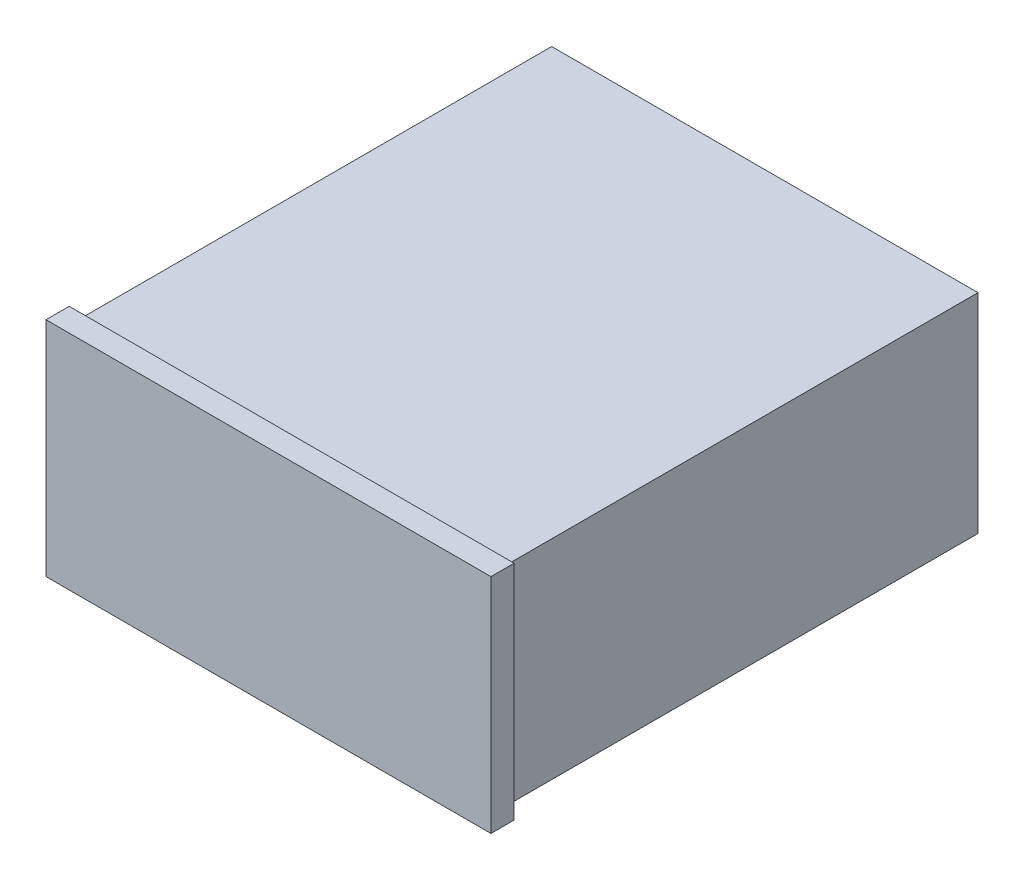
ISO-10303-21;
HEADER;
FILE_DESCRIPTION(('STEP AP214'),'2;1');
FILE_NAME('part.step','',(''),(''),'','','');
FILE_SCHEMA(('AUTOMOTIVE_DESIGN { 1 0 10303 214 1 1 1 1 }'));
ENDSEC;
DATA;
#1=APPLICATION_CONTEXT('core data for automotive mechanical design processes');
#2=APPLICATION_PROTOCOL_DEFINITION('international standard','automotive_design',2000,#1);
#3=PRODUCT_CONTEXT('',#1,'mechanical');
#4=PRODUCT('Part','Part','',(#3));
#5=PRODUCT_RELATED_PRODUCT_CATEGORY('part','',(#4));
#6=PRODUCT_DEFINITION_FORMATION('','',#4);
#7=PRODUCT_DEFINITION_CONTEXT('part definition',#1,'design');
#8=PRODUCT_DEFINITION('design','',#6,#7);
#9=PRODUCT_DEFINITION_SHAPE('','',#8);
#10=(LENGTH_UNIT() NAMED_UNIT(*) SI_UNIT(.MILLI.,.METRE.));
#11=(NAMED_UNIT(*) PLANE_ANGLE_UNIT() SI_UNIT($,.RADIAN.));
#12=(NAMED_UNIT(*) SI_UNIT($,.STERADIAN.) SOLID_ANGLE_UNIT());
#13=UNCERTAINTY_MEASURE_WITH_UNIT(LENGTH_MEASURE(1.E-05),#10,'distance_accuracy_value','');
#14=(GEOMETRIC_REPRESENTATION_CONTEXT(3) GLOBAL_UNCERTAINTY_ASSIGNED_CONTEXT((#13)) GLOBAL_UNIT_ASSIGNED_CONTEXT((#10,
#11,#12)) REPRESENTATION_CONTEXT('',''));
#15=CARTESIAN_POINT('',(0.,0.,0.));
#16=DIRECTION('',(0.,0.,1.));
#17=DIRECTION('',(1.,0.,0.));
#18=AXIS2_PLACEMENT_3D('',#15,#16,#17);
#19=CARTESIAN_POINT('',(0.,0.,107.1118));
#20=DIRECTION('',(0.,0.,1.));
#21=DIRECTION('',(1.,0.,0.));
#22=AXIS2_PLACEMENT_3D('',#19,#20,#21);
#23=PLANE('',#22);
#24=DIRECTION('',(1.,0.,0.));
#25=VECTOR('',#24,1.);
#26=CARTESIAN_POINT('',(94.0054,46.5074,107.1118));
#27=LINE('',#26,#25);
#28=CARTESIAN_POINT('',(-2.00660000000001,46.5074,107.1118));
#29=VERTEX_POINT('',#28);
#30=CARTESIAN_POINT('',(94.0054,46.5074,107.1118));
#31=VERTEX_POINT('',#30);
#32=EDGE_CURVE('E85',#29,#31,#27,.T.);
#33=ORIENTED_EDGE('',*,*,#32,.F.);
#34=DIRECTION('',(0.,-1.,0.));
#35=VECTOR('',#34,1.);
#36=CARTESIAN_POINT('',(-2.0066,46.5074,107.1118));
#37=LINE('',#36,#35);
#38=CARTESIAN_POINT('',(-2.0066,-1.4986,107.1118));
#39=VERTEX_POINT('',#38);
#40=EDGE_CURVE('E20',#39,#29,#37,.F.);
#41=ORIENTED_EDGE('',*,*,#40,.F.);
#42=DIRECTION('',(1.,0.,0.));
#43=VECTOR('',#42,1.);
#44=CARTESIAN_POINT('',(-2.0066,-1.4986,107.1118));
#45=LINE('',#44,#43);
#46=CARTESIAN_POINT('',(94.0054,-1.4986,107.1118));
#47=VERTEX_POINT('',#46);
#48=EDGE_CURVE('E80',#47,#39,#45,.F.);
#49=ORIENTED_EDGE('',*,*,#48,.F.);
#50=DIRECTION('',(0.,1.,0.));
#51=VECTOR('',#50,1.);
#52=CARTESIAN_POINT('',(94.0054,-1.4986,107.1118));
#53=LINE('',#52,#51);
#54=EDGE_CURVE('E95',#31,#47,#53,.F.);
#55=ORIENTED_EDGE('',*,*,#54,.F.);
#56=EDGE_LOOP('',(#33,#41,#49,#55));
#57=FACE_BOUND('',#56,.T.);
#58=ADVANCED_FACE('F17',(#57),#23,.T.);
#59=CARTESIAN_POINT('',(-2.0066,46.5074,102.108));
#60=DIRECTION('',(-1.,0.,0.));
#61=DIRECTION('',(0.,-1.,0.));
#62=AXIS2_PLACEMENT_3D('',#59,#60,#61);
#63=PLANE('',#62);
#64=DIRECTION('',(0.,0.,1.));
#65=VECTOR('',#64,1.);
#66=CARTESIAN_POINT('',(-2.00660000000001,46.5074,102.108));
#67=LINE('',#66,#65);
#68=CARTESIAN_POINT('',(-2.00660000000001,46.5074,102.108));
#69=VERTEX_POINT('',#68);
#70=EDGE_CURVE('E104',#69,#29,#67,.T.);
#71=ORIENTED_EDGE('',*,*,#70,.F.);
#72=DIRECTION('',(0.,1.,0.));
#73=VECTOR('',#72,1.);
#74=CARTESIAN_POINT('',(-2.0066,0.,102.108));
#75=LINE('',#74,#73);
#76=CARTESIAN_POINT('',(-2.0066,-1.4986,102.108));
#77=VERTEX_POINT('',#76);
#78=EDGE_CURVE('E92',#69,#77,#75,.F.);
#79=ORIENTED_EDGE('',*,*,#78,.T.);
#80=DIRECTION('',(0.,0.,-1.));
#81=VECTOR('',#80,1.);
#82=CARTESIAN_POINT('',(-2.0066,-1.4986,102.108));
#83=LINE('',#82,#81);
#84=EDGE_CURVE('E89',#39,#77,#83,.T.);
#85=ORIENTED_EDGE('',*,*,#84,.F.);
#86=ORIENTED_EDGE('',*,*,#40,.T.);
#87=EDGE_LOOP('',(#71,#79,#85,#86));
#88=FACE_BOUND('',#87,.T.);
#89=ADVANCED_FACE('F90',(#88),#63,.T.);
#90=CARTESIAN_POINT('',(-2.0066,-1.4986,102.108));
#91=DIRECTION('',(0.,-1.,0.));
#92=DIRECTION('',(0.,0.,-1.));
#93=AXIS2_PLACEMENT_3D('',#90,#91,#92);
#94=PLANE('',#93);
#95=ORIENTED_EDGE('',*,*,#84,.T.);
#96=DIRECTION('',(1.,0.,0.));
#97=VECTOR('',#96,1.);
#98=CARTESIAN_POINT('',(0.,-1.4986,102.108));
#99=LINE('',#98,#97);
#100=CARTESIAN_POINT('',(94.0054,-1.4986,102.108));
#101=VERTEX_POINT('',#100);
#102=EDGE_CURVE('E123',#77,#101,#99,.T.);
#103=ORIENTED_EDGE('',*,*,#102,.T.);
#104=DIRECTION('',(0.,0.,-1.));
#105=VECTOR('',#104,1.);
#106=CARTESIAN_POINT('',(94.0054,-1.4986,102.108));
#107=LINE('',#106,#105);
#108=EDGE_CURVE('E99',#47,#101,#107,.T.);
#109=ORIENTED_EDGE('',*,*,#108,.F.);
#110=ORIENTED_EDGE('',*,*,#48,.T.);
#111=EDGE_LOOP('',(#95,#103,#109,#110));
#112=FACE_BOUND('',#111,.T.);
#113=ADVANCED_FACE('F97',(#112),#94,.T.);
#114=CARTESIAN_POINT('',(94.0054,-1.4986,102.108));
#115=DIRECTION('',(1.,0.,0.));
#116=DIRECTION('',(0.,0.,-1.));
#117=AXIS2_PLACEMENT_3D('',#114,#115,#116);
#118=PLANE('',#117);
#119=ORIENTED_EDGE('',*,*,#108,.T.);
#120=DIRECTION('',(0.,1.,0.));
#121=VECTOR('',#120,1.);
#122=CARTESIAN_POINT('',(94.0054,0.,102.108));
#123=LINE('',#122,#121);
#124=CARTESIAN_POINT('',(94.0054,46.5074,102.108));
#125=VERTEX_POINT('',#124);
#126=EDGE_CURVE('E125',#101,#125,#123,.T.);
#127=ORIENTED_EDGE('',*,*,#126,.T.);
#128=DIRECTION('',(0.,0.,1.));
#129=VECTOR('',#128,1.);
#130=CARTESIAN_POINT('',(94.0054,46.5074,102.108));
#131=LINE('',#130,#129);
#132=EDGE_CURVE('E107',#31,#125,#131,.F.);
#133=ORIENTED_EDGE('',*,*,#132,.F.);
#134=ORIENTED_EDGE('',*,*,#54,.T.);
#135=EDGE_LOOP('',(#119,#127,#133,#134));
#136=FACE_BOUND('',#135,.T.);
#137=ADVANCED_FACE('F226',(#136),#118,.T.);
#138=CARTESIAN_POINT('',(94.0054,46.5074,102.108));
#139=DIRECTION('',(0.,1.,0.));
#140=DIRECTION('',(0.,0.,1.));
#141=AXIS2_PLACEMENT_3D('',#138,#139,#140);
#142=PLANE('',#141);
#143=ORIENTED_EDGE('',*,*,#132,.T.);
#144=DIRECTION('',(1.,0.,0.));
#145=VECTOR('',#144,1.);
#146=CARTESIAN_POINT('',(0.,46.5074,102.108));
#147=LINE('',#146,#145);
#148=EDGE_CURVE('E127',#125,#69,#147,.F.);
#149=ORIENTED_EDGE('',*,*,#148,.T.);
#150=ORIENTED_EDGE('',*,*,#70,.T.);
#151=ORIENTED_EDGE('',*,*,#32,.T.);
#152=EDGE_LOOP('',(#143,#149,#150,#151));
#153=FACE_BOUND('',#152,.T.);
#154=ADVANCED_FACE('F168',(#153),#142,.T.);
#155=CARTESIAN_POINT('',(91.9988,45.0088,0.));
#156=DIRECTION('',(0.,1.,0.));
#157=DIRECTION('',(0.,0.,1.));
#158=AXIS2_PLACEMENT_3D('',#155,#156,#157);
#159=PLANE('',#158);
#160=DIRECTION('',(0.,0.,1.));
#161=VECTOR('',#160,1.);
#162=CARTESIAN_POINT('',(0.,45.0088,0.));
#163=LINE('',#162,#161);
#164=CARTESIAN_POINT('',(0.,45.0088,102.108));
#165=VERTEX_POINT('',#164);
#166=CARTESIAN_POINT('',(0.,45.0088,0.));
#167=VERTEX_POINT('',#166);
#168=EDGE_CURVE('E110',#165,#167,#163,.F.);
#169=ORIENTED_EDGE('',*,*,#168,.F.);
#170=DIRECTION('',(1.,0.,0.));
#171=VECTOR('',#170,1.);
#172=CARTESIAN_POINT('',(0.,45.0088,102.108));
#173=LINE('',#172,#171);
#174=CARTESIAN_POINT('',(91.9988,45.0088,102.108));
#175=VERTEX_POINT('',#174);
#176=EDGE_CURVE('E133',#165,#175,#173,.T.);
#177=ORIENTED_EDGE('',*,*,#176,.T.);
#178=DIRECTION('',(0.,0.,-1.));
#179=VECTOR('',#178,1.);
#180=CARTESIAN_POINT('',(91.9988,45.0088,0.));
#181=LINE('',#180,#179);
#182=CARTESIAN_POINT('',(91.9988,45.0088,0.));
#183=VERTEX_POINT('',#182);
#184=EDGE_CURVE('E120',#183,#175,#181,.F.);
#185=ORIENTED_EDGE('',*,*,#184,.F.);
#186=DIRECTION('',(1.,0.,0.));
#187=VECTOR('',#186,1.);
#188=CARTESIAN_POINT('',(0.,45.0088,0.));
#189=LINE('',#188,#187);
#190=EDGE_CURVE('E114',#183,#167,#189,.F.);
#191=ORIENTED_EDGE('',*,*,#190,.T.);
#192=EDGE_LOOP('',(#169,#177,#185,#191));
#193=FACE_BOUND('',#192,.T.);
#194=ADVANCED_FACE('F152',(#193),#159,.T.);
#195=CARTESIAN_POINT('',(0.,45.0088,0.));
#196=DIRECTION('',(-1.,0.,0.));
#197=DIRECTION('',(0.,0.,1.));
#198=AXIS2_PLACEMENT_3D('',#195,#196,#197);
#199=PLANE('',#198);
#200=DIRECTION('',(0.,0.,-1.));
#201=VECTOR('',#200,1.);
#202=CARTESIAN_POINT('',(0.,0.,0.));
#203=LINE('',#202,#201);
#204=CARTESIAN_POINT('',(0.,0.,102.108));
#205=VERTEX_POINT('',#204);
#206=CARTESIAN_POINT('',(0.,0.,0.));
#207=VERTEX_POINT('',#206);
#208=EDGE_CURVE('E136',#205,#207,#203,.T.);
#209=ORIENTED_EDGE('',*,*,#208,.F.);
#210=DIRECTION('',(0.,1.,0.));
#211=VECTOR('',#210,1.);
#212=CARTESIAN_POINT('',(0.,0.,102.108));
#213=LINE('',#212,#211);
#214=EDGE_CURVE('E130',#205,#165,#213,.T.);
#215=ORIENTED_EDGE('',*,*,#214,.T.);
#216=ORIENTED_EDGE('',*,*,#168,.T.);
#217=DIRECTION('',(0.,1.,0.));
#218=VECTOR('',#217,1.);
#219=CARTESIAN_POINT('',(0.,0.,0.));
#220=LINE('',#219,#218);
#221=EDGE_CURVE('E112',#167,#207,#220,.F.);
#222=ORIENTED_EDGE('',*,*,#221,.T.);
#223=EDGE_LOOP('',(#209,#215,#216,#222));
#224=FACE_BOUND('',#223,.T.);
#225=ADVANCED_FACE('F159',(#224),#199,.T.);
#226=CARTESIAN_POINT('',(0.,0.,0.));
#227=DIRECTION('',(0.,0.,1.));
#228=DIRECTION('',(1.,0.,0.));
#229=AXIS2_PLACEMENT_3D('',#226,#227,#228);
#230=PLANE('',#229);
#231=DIRECTION('',(0.,1.,0.));
#232=VECTOR('',#231,1.);
#233=CARTESIAN_POINT('',(91.9988,0.,0.));
#234=LINE('',#233,#232);
#235=CARTESIAN_POINT('',(91.9988,0.,0.));
#236=VERTEX_POINT('',#235);
#237=EDGE_CURVE('E117',#236,#183,#234,.T.);
#238=ORIENTED_EDGE('',*,*,#237,.F.);
#239=DIRECTION('',(1.,0.,0.));
#240=VECTOR('',#239,1.);
#241=CARTESIAN_POINT('',(0.,0.,0.));
#242=LINE('',#241,#240);
#243=EDGE_CURVE('E139',#207,#236,#242,.T.);
#244=ORIENTED_EDGE('',*,*,#243,.F.);
#245=ORIENTED_EDGE('',*,*,#221,.F.);
#246=ORIENTED_EDGE('',*,*,#190,.F.);
#247=EDGE_LOOP('',(#238,#244,#245,#246));
#248=FACE_BOUND('',#247,.T.);
#249=ADVANCED_FACE('F149',(#248),#230,.F.);
#250=CARTESIAN_POINT('',(91.9988,0.,0.));
#251=DIRECTION('',(1.,0.,0.));
#252=DIRECTION('',(0.,0.,-1.));
#253=AXIS2_PLACEMENT_3D('',#250,#251,#252);
#254=PLANE('',#253);
#255=ORIENTED_EDGE('',*,*,#184,.T.);
#256=DIRECTION('',(0.,1.,0.));
#257=VECTOR('',#256,1.);
#258=CARTESIAN_POINT('',(91.9988,0.,102.108));
#259=LINE('',#258,#257);
#260=CARTESIAN_POINT('',(91.9988,0.,102.108));
#261=VERTEX_POINT('',#260);
#262=EDGE_CURVE('E35',#175,#261,#259,.F.);
#263=ORIENTED_EDGE('',*,*,#262,.T.);
#264=DIRECTION('',(0.,0.,-1.));
#265=VECTOR('',#264,1.);
#266=CARTESIAN_POINT('',(91.9988,0.,0.));
#267=LINE('',#266,#265);
#268=EDGE_CURVE('E26',#236,#261,#267,.F.);
#269=ORIENTED_EDGE('',*,*,#268,.F.);
#270=ORIENTED_EDGE('',*,*,#237,.T.);
#271=EDGE_LOOP('',(#255,#263,#269,#270));
#272=FACE_BOUND('',#271,.T.);
#273=ADVANCED_FACE('F146',(#272),#254,.T.);
#274=CARTESIAN_POINT('',(0.,0.,102.108));
#275=DIRECTION('',(0.,0.,1.));
#276=DIRECTION('',(1.,0.,0.));
#277=AXIS2_PLACEMENT_3D('',#274,#275,#276);
#278=PLANE('',#277);
#279=ORIENTED_EDGE('',*,*,#262,.F.);
#280=ORIENTED_EDGE('',*,*,#176,.F.);
#281=ORIENTED_EDGE('',*,*,#214,.F.);
#282=DIRECTION('',(1.,0.,0.));
#283=VECTOR('',#282,1.);
#284=CARTESIAN_POINT('',(0.,0.,102.108));
#285=LINE('',#284,#283);
#286=EDGE_CURVE('E11',#261,#205,#285,.F.);
#287=ORIENTED_EDGE('',*,*,#286,.F.);
#288=EDGE_LOOP('',(#279,#280,#281,#287));
#289=FACE_BOUND('',#288,.T.);
#290=ORIENTED_EDGE('',*,*,#126,.F.);
#291=ORIENTED_EDGE('',*,*,#102,.F.);
#292=ORIENTED_EDGE('',*,*,#78,.F.);
#293=ORIENTED_EDGE('',*,*,#148,.F.);
#294=EDGE_LOOP('',(#290,#291,#292,#293));
#295=FACE_BOUND('',#294,.T.);
#296=ADVANCED_FACE('F156',(#289,#295),#278,.F.);
#297=CARTESIAN_POINT('',(0.,0.,0.));
#298=DIRECTION('',(0.,-1.,0.));
#299=DIRECTION('',(0.,0.,-1.));
#300=AXIS2_PLACEMENT_3D('',#297,#298,#299);
#301=PLANE('',#300);
#302=ORIENTED_EDGE('',*,*,#268,.T.);
#303=ORIENTED_EDGE('',*,*,#286,.T.);
#304=ORIENTED_EDGE('',*,*,#208,.T.);
#305=ORIENTED_EDGE('',*,*,#243,.T.);
#306=EDGE_LOOP('',(#302,#303,#304,#305));
#307=FACE_BOUND('',#306,.T.);
#308=ADVANCED_FACE('F144',(#307),#301,.T.);
#309=CLOSED_SHELL('',(#58,#89,#113,#137,#154,#194,#225,#249,#273,#296,#308));
#310=MANIFOLD_SOLID_BREP('B1',#309);
#311=ADVANCED_BREP_SHAPE_REPRESENTATION('',(#18,#310),#14);
#312=SHAPE_DEFINITION_REPRESENTATION(#9,#311);
ENDSEC;
END-ISO-10303-21;
